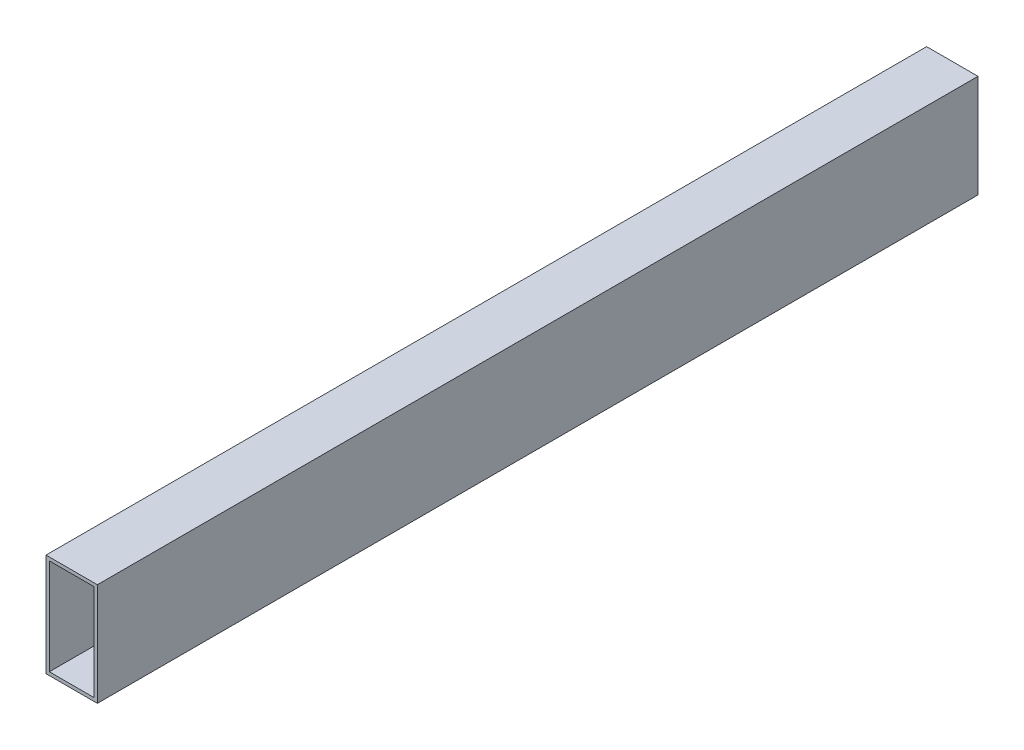
ISO-10303-21;
HEADER;
FILE_DESCRIPTION(('STEP AP214'),'2;1');
FILE_NAME('part.step','',(''),(''),'','','');
FILE_SCHEMA(('AUTOMOTIVE_DESIGN { 1 0 10303 214 1 1 1 1 }'));
ENDSEC;
DATA;
#1=APPLICATION_CONTEXT('core data for automotive mechanical design processes');
#2=APPLICATION_PROTOCOL_DEFINITION('international standard','automotive_design',2000,#1);
#3=PRODUCT_CONTEXT('',#1,'mechanical');
#4=PRODUCT('Part','Part','',(#3));
#5=PRODUCT_RELATED_PRODUCT_CATEGORY('part','',(#4));
#6=PRODUCT_DEFINITION_FORMATION('','',#4);
#7=PRODUCT_DEFINITION_CONTEXT('part definition',#1,'design');
#8=PRODUCT_DEFINITION('design','',#6,#7);
#9=PRODUCT_DEFINITION_SHAPE('','',#8);
#10=(LENGTH_UNIT() NAMED_UNIT(*) SI_UNIT(.MILLI.,.METRE.));
#11=(NAMED_UNIT(*) PLANE_ANGLE_UNIT() SI_UNIT($,.RADIAN.));
#12=(NAMED_UNIT(*) SI_UNIT($,.STERADIAN.) SOLID_ANGLE_UNIT());
#13=UNCERTAINTY_MEASURE_WITH_UNIT(LENGTH_MEASURE(1.E-05),#10,'distance_accuracy_value','');
#14=(GEOMETRIC_REPRESENTATION_CONTEXT(3) GLOBAL_UNCERTAINTY_ASSIGNED_CONTEXT((#13)) GLOBAL_UNIT_ASSIGNED_CONTEXT((#10,
#11,#12)) REPRESENTATION_CONTEXT('',''));
#15=CARTESIAN_POINT('',(0.,0.,0.));
#16=DIRECTION('',(0.,0.,1.));
#17=DIRECTION('',(1.,0.,0.));
#18=AXIS2_PLACEMENT_3D('',#15,#16,#17);
#19=CARTESIAN_POINT('',(-48.4372093023255,-30.1994186046511,435.356));
#20=DIRECTION('',(1.,0.,0.));
#21=DIRECTION('',(0.,0.,-1.));
#22=AXIS2_PLACEMENT_3D('',#19,#20,#21);
#23=PLANE('',#22);
#24=DIRECTION('',(0.,-1.,0.));
#25=VECTOR('',#24,1.);
#26=CARTESIAN_POINT('',(-48.4372093023255,-30.1994186046511,0.));
#27=LINE('',#26,#25);
#28=CARTESIAN_POINT('',(-48.4372093023255,20.6005813953489,0.));
#29=VERTEX_POINT('',#28);
#30=CARTESIAN_POINT('',(-48.4372093023255,-30.1994186046511,0.));
#31=VERTEX_POINT('',#30);
#32=EDGE_CURVE('E132',#29,#31,#27,.T.);
#33=ORIENTED_EDGE('',*,*,#32,.T.);
#34=DIRECTION('',(0.,0.,-1.));
#35=VECTOR('',#34,1.);
#36=CARTESIAN_POINT('',(-48.4372093023255,-30.1994186046511,435.356));
#37=LINE('',#36,#35);
#38=CARTESIAN_POINT('',(-48.4372093023255,-30.1994186046511,435.356));
#39=VERTEX_POINT('',#38);
#40=EDGE_CURVE('E11',#39,#31,#37,.T.);
#41=ORIENTED_EDGE('',*,*,#40,.F.);
#42=DIRECTION('',(0.,-1.,0.));
#43=VECTOR('',#42,1.);
#44=CARTESIAN_POINT('',(-48.4372093023255,-30.1994186046511,435.356));
#45=LINE('',#44,#43);
#46=CARTESIAN_POINT('',(-48.4372093023255,20.6005813953489,435.356));
#47=VERTEX_POINT('',#46);
#48=EDGE_CURVE('E136',#47,#39,#45,.T.);
#49=ORIENTED_EDGE('',*,*,#48,.F.);
#50=DIRECTION('',(0.,0.,-1.));
#51=VECTOR('',#50,1.);
#52=CARTESIAN_POINT('',(-48.4372093023255,20.6005813953489,435.356));
#53=LINE('',#52,#51);
#54=EDGE_CURVE('E146',#47,#29,#53,.T.);
#55=ORIENTED_EDGE('',*,*,#54,.T.);
#56=EDGE_LOOP('',(#33,#41,#49,#55));
#57=FACE_BOUND('',#56,.T.);
#58=ADVANCED_FACE('F35',(#57),#23,.F.);
#59=CARTESIAN_POINT('',(-48.4372093023255,-30.1994186046511,435.356));
#60=DIRECTION('',(0.,1.,0.));
#61=DIRECTION('',(0.,0.,1.));
#62=AXIS2_PLACEMENT_3D('',#59,#60,#61);
#63=PLANE('',#62);
#64=DIRECTION('',(1.,0.,0.));
#65=VECTOR('',#64,1.);
#66=CARTESIAN_POINT('',(-48.4372093023255,-30.1994186046511,0.));
#67=LINE('',#66,#65);
#68=CARTESIAN_POINT('',(-23.0372093023255,-30.1994186046511,0.));
#69=VERTEX_POINT('',#68);
#70=EDGE_CURVE('E149',#31,#69,#67,.T.);
#71=ORIENTED_EDGE('',*,*,#70,.T.);
#72=DIRECTION('',(0.,0.,-1.));
#73=VECTOR('',#72,1.);
#74=CARTESIAN_POINT('',(-23.0372093023255,-30.1994186046511,435.356));
#75=LINE('',#74,#73);
#76=CARTESIAN_POINT('',(-23.0372093023255,-30.1994186046511,435.356));
#77=VERTEX_POINT('',#76);
#78=EDGE_CURVE('E42',#77,#69,#75,.T.);
#79=ORIENTED_EDGE('',*,*,#78,.F.);
#80=DIRECTION('',(1.,0.,0.));
#81=VECTOR('',#80,1.);
#82=CARTESIAN_POINT('',(-48.4372093023255,-30.1994186046511,435.356));
#83=LINE('',#82,#81);
#84=EDGE_CURVE('E139',#39,#77,#83,.T.);
#85=ORIENTED_EDGE('',*,*,#84,.F.);
#86=ORIENTED_EDGE('',*,*,#40,.T.);
#87=EDGE_LOOP('',(#71,#79,#85,#86));
#88=FACE_BOUND('',#87,.T.);
#89=ADVANCED_FACE('F177',(#88),#63,.F.);
#90=CARTESIAN_POINT('',(-23.0372093023255,-30.1994186046511,435.356));
#91=DIRECTION('',(-1.,0.,0.));
#92=DIRECTION('',(0.,-1.,0.));
#93=AXIS2_PLACEMENT_3D('',#90,#91,#92);
#94=PLANE('',#93);
#95=DIRECTION('',(0.,1.,0.));
#96=VECTOR('',#95,1.);
#97=CARTESIAN_POINT('',(-23.0372093023255,-30.1994186046511,0.));
#98=LINE('',#97,#96);
#99=CARTESIAN_POINT('',(-23.0372093023255,20.6005813953489,0.));
#100=VERTEX_POINT('',#99);
#101=EDGE_CURVE('E151',#69,#100,#98,.T.);
#102=ORIENTED_EDGE('',*,*,#101,.T.);
#103=DIRECTION('',(0.,0.,-1.));
#104=VECTOR('',#103,1.);
#105=CARTESIAN_POINT('',(-23.0372093023255,20.6005813953489,435.356));
#106=LINE('',#105,#104);
#107=CARTESIAN_POINT('',(-23.0372093023255,20.6005813953489,435.356));
#108=VERTEX_POINT('',#107);
#109=EDGE_CURVE('E156',#108,#100,#106,.T.);
#110=ORIENTED_EDGE('',*,*,#109,.F.);
#111=DIRECTION('',(0.,1.,0.));
#112=VECTOR('',#111,1.);
#113=CARTESIAN_POINT('',(-23.0372093023255,-30.1994186046511,435.356));
#114=LINE('',#113,#112);
#115=EDGE_CURVE('E142',#77,#108,#114,.T.);
#116=ORIENTED_EDGE('',*,*,#115,.F.);
#117=ORIENTED_EDGE('',*,*,#78,.T.);
#118=EDGE_LOOP('',(#102,#110,#116,#117));
#119=FACE_BOUND('',#118,.T.);
#120=ADVANCED_FACE('F163',(#119),#94,.F.);
#121=CARTESIAN_POINT('',(-48.4372093023255,20.6005813953489,435.356));
#122=DIRECTION('',(0.,-1.,0.));
#123=DIRECTION('',(0.,0.,-1.));
#124=AXIS2_PLACEMENT_3D('',#121,#122,#123);
#125=PLANE('',#124);
#126=DIRECTION('',(-1.,0.,0.));
#127=VECTOR('',#126,1.);
#128=CARTESIAN_POINT('',(-48.4372093023255,20.6005813953489,0.));
#129=LINE('',#128,#127);
#130=EDGE_CURVE('E140',#100,#29,#129,.T.);
#131=ORIENTED_EDGE('',*,*,#130,.T.);
#132=ORIENTED_EDGE('',*,*,#54,.F.);
#133=DIRECTION('',(-1.,0.,0.));
#134=VECTOR('',#133,1.);
#135=CARTESIAN_POINT('',(-48.4372093023255,20.6005813953489,435.356));
#136=LINE('',#135,#134);
#137=EDGE_CURVE('E144',#108,#47,#136,.T.);
#138=ORIENTED_EDGE('',*,*,#137,.F.);
#139=ORIENTED_EDGE('',*,*,#109,.T.);
#140=EDGE_LOOP('',(#131,#132,#138,#139));
#141=FACE_BOUND('',#140,.T.);
#142=ADVANCED_FACE('F170',(#141),#125,.F.);
#143=CARTESIAN_POINT('',(0.,0.,435.356));
#144=DIRECTION('',(0.,0.,-1.));
#145=DIRECTION('',(-1.,0.,0.));
#146=AXIS2_PLACEMENT_3D('',#143,#144,#145);
#147=PLANE('',#146);
#148=DIRECTION('',(-1.,0.,0.));
#149=VECTOR('',#148,1.);
#150=CARTESIAN_POINT('',(-46.7862093023255,18.9495813953489,435.356));
#151=LINE('',#150,#149);
#152=CARTESIAN_POINT('',(-24.6882093023255,18.9495813953489,435.356));
#153=VERTEX_POINT('',#152);
#154=CARTESIAN_POINT('',(-46.7862093023255,18.9495813953489,435.356));
#155=VERTEX_POINT('',#154);
#156=EDGE_CURVE('E126',#153,#155,#151,.T.);
#157=ORIENTED_EDGE('',*,*,#156,.F.);
#158=DIRECTION('',(0.,1.,0.));
#159=VECTOR('',#158,1.);
#160=CARTESIAN_POINT('',(-24.6882093023255,18.9495813953489,435.356));
#161=LINE('',#160,#159);
#162=CARTESIAN_POINT('',(-24.6882093023255,-28.5484186046511,435.356));
#163=VERTEX_POINT('',#162);
#164=EDGE_CURVE('E49',#163,#153,#161,.T.);
#165=ORIENTED_EDGE('',*,*,#164,.F.);
#166=DIRECTION('',(1.,0.,0.));
#167=VECTOR('',#166,1.);
#168=CARTESIAN_POINT('',(-46.7862093023255,-28.5484186046511,435.356));
#169=LINE('',#168,#167);
#170=CARTESIAN_POINT('',(-46.7862093023255,-28.5484186046511,435.356));
#171=VERTEX_POINT('',#170);
#172=EDGE_CURVE('E117',#171,#163,#169,.T.);
#173=ORIENTED_EDGE('',*,*,#172,.F.);
#174=DIRECTION('',(0.,-1.,0.));
#175=VECTOR('',#174,1.);
#176=CARTESIAN_POINT('',(-46.7862093023255,18.9495813953489,435.356));
#177=LINE('',#176,#175);
#178=EDGE_CURVE('E120',#155,#171,#177,.T.);
#179=ORIENTED_EDGE('',*,*,#178,.F.);
#180=EDGE_LOOP('',(#157,#165,#173,#179));
#181=FACE_BOUND('',#180,.T.);
#182=ORIENTED_EDGE('',*,*,#48,.T.);
#183=ORIENTED_EDGE('',*,*,#84,.T.);
#184=ORIENTED_EDGE('',*,*,#115,.T.);
#185=ORIENTED_EDGE('',*,*,#137,.T.);
#186=EDGE_LOOP('',(#182,#183,#184,#185));
#187=FACE_BOUND('',#186,.T.);
#188=ADVANCED_FACE('F176',(#181,#187),#147,.F.);
#189=CARTESIAN_POINT('',(0.,0.,0.));
#190=DIRECTION('',(0.,0.,-1.));
#191=DIRECTION('',(-1.,0.,0.));
#192=AXIS2_PLACEMENT_3D('',#189,#190,#191);
#193=PLANE('',#192);
#194=DIRECTION('',(0.,1.,0.));
#195=VECTOR('',#194,1.);
#196=CARTESIAN_POINT('',(-24.6882093023255,18.9495813953489,0.));
#197=LINE('',#196,#195);
#198=CARTESIAN_POINT('',(-24.6882093023255,-28.5484186046511,0.));
#199=VERTEX_POINT('',#198);
#200=CARTESIAN_POINT('',(-24.6882093023255,18.9495813953489,0.));
#201=VERTEX_POINT('',#200);
#202=EDGE_CURVE('E101',#199,#201,#197,.T.);
#203=ORIENTED_EDGE('',*,*,#202,.T.);
#204=DIRECTION('',(-1.,0.,0.));
#205=VECTOR('',#204,1.);
#206=CARTESIAN_POINT('',(-46.7862093023255,18.9495813953489,0.));
#207=LINE('',#206,#205);
#208=CARTESIAN_POINT('',(-46.7862093023255,18.9495813953489,0.));
#209=VERTEX_POINT('',#208);
#210=EDGE_CURVE('E110',#201,#209,#207,.T.);
#211=ORIENTED_EDGE('',*,*,#210,.T.);
#212=DIRECTION('',(0.,-1.,0.));
#213=VECTOR('',#212,1.);
#214=CARTESIAN_POINT('',(-46.7862093023255,18.9495813953489,0.));
#215=LINE('',#214,#213);
#216=CARTESIAN_POINT('',(-46.7862093023255,-28.5484186046511,0.));
#217=VERTEX_POINT('',#216);
#218=EDGE_CURVE('E57',#209,#217,#215,.T.);
#219=ORIENTED_EDGE('',*,*,#218,.T.);
#220=DIRECTION('',(1.,0.,0.));
#221=VECTOR('',#220,1.);
#222=CARTESIAN_POINT('',(-46.7862093023255,-28.5484186046511,0.));
#223=LINE('',#222,#221);
#224=EDGE_CURVE('E107',#217,#199,#223,.T.);
#225=ORIENTED_EDGE('',*,*,#224,.T.);
#226=EDGE_LOOP('',(#203,#211,#219,#225));
#227=FACE_BOUND('',#226,.T.);
#228=ORIENTED_EDGE('',*,*,#32,.F.);
#229=ORIENTED_EDGE('',*,*,#130,.F.);
#230=ORIENTED_EDGE('',*,*,#101,.F.);
#231=ORIENTED_EDGE('',*,*,#70,.F.);
#232=EDGE_LOOP('',(#228,#229,#230,#231));
#233=FACE_BOUND('',#232,.T.);
#234=ADVANCED_FACE('F114',(#227,#233),#193,.T.);
#235=CARTESIAN_POINT('',(-24.6882093023255,18.9495813953489,0.));
#236=DIRECTION('',(1.,0.,0.));
#237=DIRECTION('',(0.,1.,0.));
#238=AXIS2_PLACEMENT_3D('',#235,#236,#237);
#239=PLANE('',#238);
#240=ORIENTED_EDGE('',*,*,#164,.T.);
#241=DIRECTION('',(0.,0.,1.));
#242=VECTOR('',#241,1.);
#243=CARTESIAN_POINT('',(-24.6882093023255,18.9495813953489,0.));
#244=LINE('',#243,#242);
#245=EDGE_CURVE('E97',#201,#153,#244,.T.);
#246=ORIENTED_EDGE('',*,*,#245,.F.);
#247=ORIENTED_EDGE('',*,*,#202,.F.);
#248=DIRECTION('',(0.,0.,1.));
#249=VECTOR('',#248,1.);
#250=CARTESIAN_POINT('',(-24.6882093023255,-28.5484186046511,0.));
#251=LINE('',#250,#249);
#252=EDGE_CURVE('E130',#199,#163,#251,.T.);
#253=ORIENTED_EDGE('',*,*,#252,.T.);
#254=EDGE_LOOP('',(#240,#246,#247,#253));
#255=FACE_BOUND('',#254,.T.);
#256=ADVANCED_FACE('F99',(#255),#239,.F.);
#257=CARTESIAN_POINT('',(-46.7862093023255,-28.5484186046511,0.));
#258=DIRECTION('',(0.,-1.,0.));
#259=DIRECTION('',(0.,0.,-1.));
#260=AXIS2_PLACEMENT_3D('',#257,#258,#259);
#261=PLANE('',#260);
#262=ORIENTED_EDGE('',*,*,#172,.T.);
#263=ORIENTED_EDGE('',*,*,#252,.F.);
#264=ORIENTED_EDGE('',*,*,#224,.F.);
#265=DIRECTION('',(0.,0.,1.));
#266=VECTOR('',#265,1.);
#267=CARTESIAN_POINT('',(-46.7862093023255,-28.5484186046511,0.));
#268=LINE('',#267,#266);
#269=EDGE_CURVE('E133',#217,#171,#268,.T.);
#270=ORIENTED_EDGE('',*,*,#269,.T.);
#271=EDGE_LOOP('',(#262,#263,#264,#270));
#272=FACE_BOUND('',#271,.T.);
#273=ADVANCED_FACE('F194',(#272),#261,.F.);
#274=CARTESIAN_POINT('',(-46.7862093023255,18.9495813953489,0.));
#275=DIRECTION('',(-1.,0.,0.));
#276=DIRECTION('',(0.,-1.,0.));
#277=AXIS2_PLACEMENT_3D('',#274,#275,#276);
#278=PLANE('',#277);
#279=ORIENTED_EDGE('',*,*,#178,.T.);
#280=ORIENTED_EDGE('',*,*,#269,.F.);
#281=ORIENTED_EDGE('',*,*,#218,.F.);
#282=DIRECTION('',(0.,0.,1.));
#283=VECTOR('',#282,1.);
#284=CARTESIAN_POINT('',(-46.7862093023255,18.9495813953489,0.));
#285=LINE('',#284,#283);
#286=EDGE_CURVE('E106',#209,#155,#285,.T.);
#287=ORIENTED_EDGE('',*,*,#286,.T.);
#288=EDGE_LOOP('',(#279,#280,#281,#287));
#289=FACE_BOUND('',#288,.T.);
#290=ADVANCED_FACE('F197',(#289),#278,.F.);
#291=CARTESIAN_POINT('',(-46.7862093023255,18.9495813953489,0.));
#292=DIRECTION('',(0.,1.,0.));
#293=DIRECTION('',(0.,0.,1.));
#294=AXIS2_PLACEMENT_3D('',#291,#292,#293);
#295=PLANE('',#294);
#296=ORIENTED_EDGE('',*,*,#156,.T.);
#297=ORIENTED_EDGE('',*,*,#286,.F.);
#298=ORIENTED_EDGE('',*,*,#210,.F.);
#299=ORIENTED_EDGE('',*,*,#245,.T.);
#300=EDGE_LOOP('',(#296,#297,#298,#299));
#301=FACE_BOUND('',#300,.T.);
#302=ADVANCED_FACE('F111',(#301),#295,.F.);
#303=CLOSED_SHELL('',(#58,#89,#120,#142,#188,#234,#256,#273,#290,#302));
#304=MANIFOLD_SOLID_BREP('B2',#303);
#305=ADVANCED_BREP_SHAPE_REPRESENTATION('',(#18,#304),#14);
#306=SHAPE_DEFINITION_REPRESENTATION(#9,#305);
ENDSEC;
END-ISO-10303-21;
